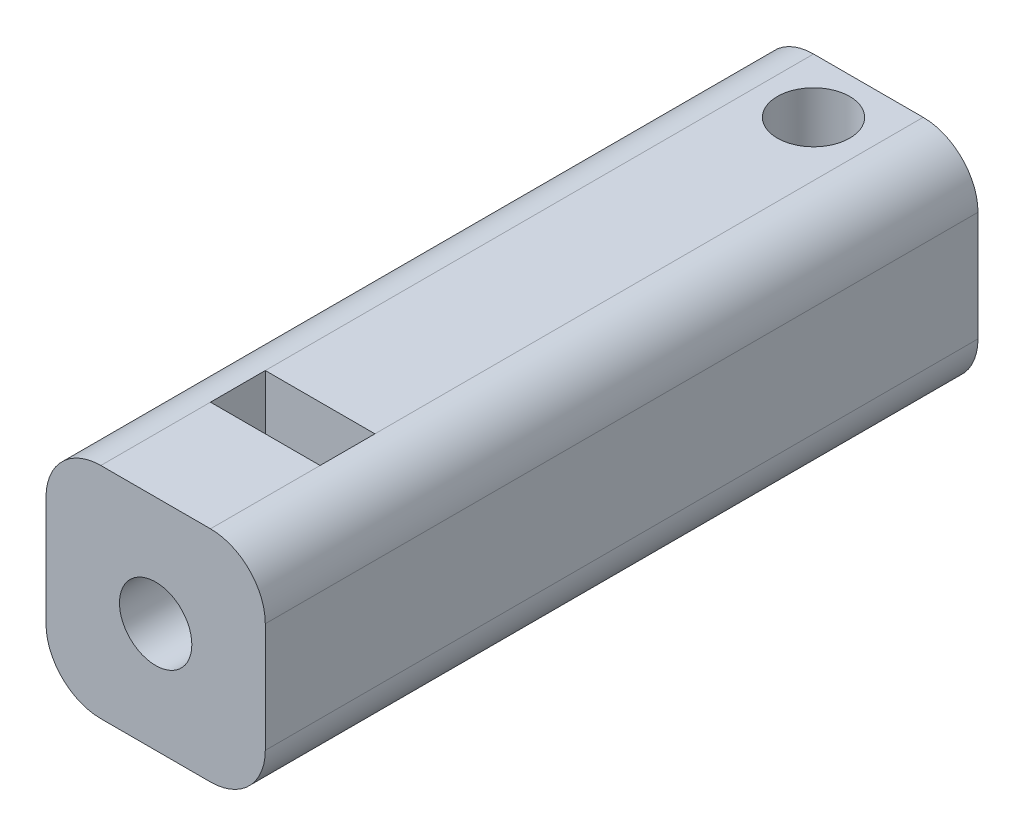
ISO-10303-21;
HEADER;
FILE_DESCRIPTION(('STEP AP214'),'2;1');
FILE_NAME('part.step','',(''),(''),'','','');
FILE_SCHEMA(('AUTOMOTIVE_DESIGN { 1 0 10303 214 1 1 1 1 }'));
ENDSEC;
DATA;
#1=APPLICATION_CONTEXT('core data for automotive mechanical design processes');
#2=APPLICATION_PROTOCOL_DEFINITION('international standard','automotive_design',2000,#1);
#3=PRODUCT_CONTEXT('',#1,'mechanical');
#4=PRODUCT('Part','Part','',(#3));
#5=PRODUCT_RELATED_PRODUCT_CATEGORY('part','',(#4));
#6=PRODUCT_DEFINITION_FORMATION('','',#4);
#7=PRODUCT_DEFINITION_CONTEXT('part definition',#1,'design');
#8=PRODUCT_DEFINITION('design','',#6,#7);
#9=PRODUCT_DEFINITION_SHAPE('','',#8);
#10=(LENGTH_UNIT() NAMED_UNIT(*) SI_UNIT(.MILLI.,.METRE.));
#11=(NAMED_UNIT(*) PLANE_ANGLE_UNIT() SI_UNIT($,.RADIAN.));
#12=(NAMED_UNIT(*) SI_UNIT($,.STERADIAN.) SOLID_ANGLE_UNIT());
#13=UNCERTAINTY_MEASURE_WITH_UNIT(LENGTH_MEASURE(1.E-05),#10,'distance_accuracy_value','');
#14=(GEOMETRIC_REPRESENTATION_CONTEXT(3) GLOBAL_UNCERTAINTY_ASSIGNED_CONTEXT((#13)) GLOBAL_UNIT_ASSIGNED_CONTEXT((#10,
#11,#12)) REPRESENTATION_CONTEXT('',''));
#15=CARTESIAN_POINT('',(0.,0.,0.));
#16=DIRECTION('',(0.,0.,1.));
#17=DIRECTION('',(1.,0.,0.));
#18=AXIS2_PLACEMENT_3D('',#15,#16,#17);
#19=CARTESIAN_POINT('',(0.,0.,0.));
#20=DIRECTION('',(0.,0.,1.));
#21=DIRECTION('',(1.,0.,0.));
#22=AXIS2_PLACEMENT_3D('',#19,#20,#21);
#23=CYLINDRICAL_SURFACE('',#22,3.3);
#24=CARTESIAN_POINT('',(0.,0.,55.));
#25=DIRECTION('',(0.,0.,1.));
#26=DIRECTION('',(1.,0.,0.));
#27=AXIS2_PLACEMENT_3D('',#24,#25,#26);
#28=CIRCLE('',#27,3.3);
#29=CARTESIAN_POINT('',(3.3,0.,55.));
#30=VERTEX_POINT('',#29);
#31=EDGE_CURVE('E319',#30,#30,#28,.F.);
#32=ORIENTED_EDGE('',*,*,#31,.T.);
#33=EDGE_LOOP('',(#32));
#34=FACE_BOUND('',#33,.T.);
#35=CARTESIAN_POINT('',(0.,0.,65.));
#36=DIRECTION('',(0.,0.,1.));
#37=DIRECTION('',(1.,0.,0.));
#38=AXIS2_PLACEMENT_3D('',#35,#36,#37);
#39=CIRCLE('',#38,3.3);
#40=CARTESIAN_POINT('',(3.3,0.,65.));
#41=VERTEX_POINT('',#40);
#42=EDGE_CURVE('E328',#41,#41,#39,.T.);
#43=ORIENTED_EDGE('',*,*,#42,.T.);
#44=EDGE_LOOP('',(#43));
#45=FACE_BOUND('',#44,.T.);
#46=ADVANCED_FACE('F41',(#34,#45),#23,.F.);
#47=CARTESIAN_POINT('',(-10.,10.,65.));
#48=DIRECTION('',(0.,-1.,0.));
#49=DIRECTION('',(0.,0.,-1.));
#50=AXIS2_PLACEMENT_3D('',#47,#48,#49);
#51=PLANE('',#50);
#52=DIRECTION('',(0.,0.,-1.));
#53=VECTOR('',#52,1.);
#54=CARTESIAN_POINT('',(5.,10.,65.));
#55=LINE('',#54,#53);
#56=CARTESIAN_POINT('',(5.,10.,65.));
#57=VERTEX_POINT('',#56);
#58=CARTESIAN_POINT('',(5.,10.,55.));
#59=VERTEX_POINT('',#58);
#60=EDGE_CURVE('E264',#57,#59,#55,.T.);
#61=ORIENTED_EDGE('',*,*,#60,.T.);
#62=DIRECTION('',(-1.,0.,0.));
#63=VECTOR('',#62,1.);
#64=CARTESIAN_POINT('',(-5.,10.,55.));
#65=LINE('',#64,#63);
#66=CARTESIAN_POINT('',(-5.,10.,55.));
#67=VERTEX_POINT('',#66);
#68=EDGE_CURVE('E145',#59,#67,#65,.T.);
#69=ORIENTED_EDGE('',*,*,#68,.T.);
#70=DIRECTION('',(0.,0.,-1.));
#71=VECTOR('',#70,1.);
#72=CARTESIAN_POINT('',(-5.,10.,65.));
#73=LINE('',#72,#71);
#74=CARTESIAN_POINT('',(-5.,10.,65.));
#75=VERTEX_POINT('',#74);
#76=EDGE_CURVE('E164',#67,#75,#73,.F.);
#77=ORIENTED_EDGE('',*,*,#76,.T.);
#78=DIRECTION('',(-1.,0.,0.));
#79=VECTOR('',#78,1.);
#80=CARTESIAN_POINT('',(-10.,10.,65.));
#81=LINE('',#80,#79);
#82=EDGE_CURVE('E218',#57,#75,#81,.T.);
#83=ORIENTED_EDGE('',*,*,#82,.F.);
#84=EDGE_LOOP('',(#61,#69,#77,#83));
#85=FACE_BOUND('',#84,.T.);
#86=ADVANCED_FACE('F345',(#85),#51,.F.);
#87=CARTESIAN_POINT('',(-10.,-10.,65.));
#88=DIRECTION('',(0.,1.,0.));
#89=DIRECTION('',(0.,0.,1.));
#90=AXIS2_PLACEMENT_3D('',#87,#88,#89);
#91=PLANE('',#90);
#92=DIRECTION('',(0.,0.,-1.));
#93=VECTOR('',#92,1.);
#94=CARTESIAN_POINT('',(-5.,-10.,65.));
#95=LINE('',#94,#93);
#96=CARTESIAN_POINT('',(-5.,-10.,65.));
#97=VERTEX_POINT('',#96);
#98=CARTESIAN_POINT('',(-5.,-10.,55.));
#99=VERTEX_POINT('',#98);
#100=EDGE_CURVE('E185',#97,#99,#95,.T.);
#101=ORIENTED_EDGE('',*,*,#100,.T.);
#102=DIRECTION('',(-1.,0.,0.));
#103=VECTOR('',#102,1.);
#104=CARTESIAN_POINT('',(-5.,-10.,55.));
#105=LINE('',#104,#103);
#106=CARTESIAN_POINT('',(5.,-10.,55.));
#107=VERTEX_POINT('',#106);
#108=EDGE_CURVE('E166',#107,#99,#105,.T.);
#109=ORIENTED_EDGE('',*,*,#108,.F.);
#110=DIRECTION('',(0.,0.,1.));
#111=VECTOR('',#110,1.);
#112=CARTESIAN_POINT('',(5.,-10.,65.));
#113=LINE('',#112,#111);
#114=CARTESIAN_POINT('',(5.,-10.,65.));
#115=VERTEX_POINT('',#114);
#116=EDGE_CURVE('E210',#107,#115,#113,.T.);
#117=ORIENTED_EDGE('',*,*,#116,.T.);
#118=DIRECTION('',(1.,0.,0.));
#119=VECTOR('',#118,1.);
#120=CARTESIAN_POINT('',(-10.,-10.,65.));
#121=LINE('',#120,#119);
#122=EDGE_CURVE('E199',#97,#115,#121,.T.);
#123=ORIENTED_EDGE('',*,*,#122,.F.);
#124=EDGE_LOOP('',(#101,#109,#117,#123));
#125=FACE_BOUND('',#124,.T.);
#126=ADVANCED_FACE('F208',(#125),#91,.F.);
#127=CARTESIAN_POINT('',(-5.,-5.,65.));
#128=DIRECTION('',(0.,0.,-1.));
#129=DIRECTION('',(-1.,0.,0.));
#130=AXIS2_PLACEMENT_3D('',#127,#128,#129);
#131=CYLINDRICAL_SURFACE('',#130,5.);
#132=ORIENTED_EDGE('',*,*,#100,.F.);
#133=CARTESIAN_POINT('',(-5.,-5.,65.));
#134=DIRECTION('',(0.,0.,-1.));
#135=DIRECTION('',(-1.,0.,0.));
#136=AXIS2_PLACEMENT_3D('',#133,#134,#135);
#137=CIRCLE('',#136,5.);
#138=CARTESIAN_POINT('',(-10.,-5.,65.));
#139=VERTEX_POINT('',#138);
#140=EDGE_CURVE('E50',#139,#97,#137,.F.);
#141=ORIENTED_EDGE('',*,*,#140,.F.);
#142=DIRECTION('',(0.,0.,-1.));
#143=VECTOR('',#142,1.);
#144=CARTESIAN_POINT('',(-10.,-5.,65.));
#145=LINE('',#144,#143);
#146=CARTESIAN_POINT('',(-10.,-5.,0.));
#147=VERTEX_POINT('',#146);
#148=EDGE_CURVE('E189',#147,#139,#145,.F.);
#149=ORIENTED_EDGE('',*,*,#148,.F.);
#150=CARTESIAN_POINT('',(-5.,-5.,0.));
#151=DIRECTION('',(0.,0.,-1.));
#152=DIRECTION('',(-1.,0.,0.));
#153=AXIS2_PLACEMENT_3D('',#150,#151,#152);
#154=CIRCLE('',#153,5.);
#155=CARTESIAN_POINT('',(-5.,-10.,0.));
#156=VERTEX_POINT('',#155);
#157=EDGE_CURVE('E11',#156,#147,#154,.T.);
#158=ORIENTED_EDGE('',*,*,#157,.F.);
#159=CARTESIAN_POINT('',(-5.,-10.,50.));
#160=VERTEX_POINT('',#159);
#161=EDGE_CURVE('E184',#160,#156,#95,.T.);
#162=ORIENTED_EDGE('',*,*,#161,.F.);
#163=DIRECTION('',(0.,0.,-1.));
#164=VECTOR('',#163,1.);
#165=CARTESIAN_POINT('',(-5.,-10.,50.));
#166=LINE('',#165,#164);
#167=EDGE_CURVE('E65',#99,#160,#166,.T.);
#168=ORIENTED_EDGE('',*,*,#167,.F.);
#169=EDGE_LOOP('',(#132,#141,#149,#158,#162,#168));
#170=FACE_BOUND('',#169,.T.);
#171=ADVANCED_FACE('F43',(#170),#131,.T.);
#172=CARTESIAN_POINT('',(-5.,5.,65.));
#173=DIRECTION('',(0.,0.,-1.));
#174=DIRECTION('',(-1.,0.,0.));
#175=AXIS2_PLACEMENT_3D('',#172,#173,#174);
#176=CYLINDRICAL_SURFACE('',#175,5.);
#177=DIRECTION('',(0.,0.,-1.));
#178=VECTOR('',#177,1.);
#179=CARTESIAN_POINT('',(-10.,5.,65.));
#180=LINE('',#179,#178);
#181=CARTESIAN_POINT('',(-10.,5.,65.));
#182=VERTEX_POINT('',#181);
#183=CARTESIAN_POINT('',(-10.,5.,0.));
#184=VERTEX_POINT('',#183);
#185=EDGE_CURVE('E178',#182,#184,#180,.T.);
#186=ORIENTED_EDGE('',*,*,#185,.F.);
#187=CARTESIAN_POINT('',(-5.,5.,65.));
#188=DIRECTION('',(0.,0.,-1.));
#189=DIRECTION('',(-1.,0.,0.));
#190=AXIS2_PLACEMENT_3D('',#187,#188,#189);
#191=CIRCLE('',#190,5.);
#192=EDGE_CURVE('E172',#75,#182,#191,.F.);
#193=ORIENTED_EDGE('',*,*,#192,.F.);
#194=ORIENTED_EDGE('',*,*,#76,.F.);
#195=DIRECTION('',(0.,0.,-1.));
#196=VECTOR('',#195,1.);
#197=CARTESIAN_POINT('',(-5.,10.,50.));
#198=LINE('',#197,#196);
#199=CARTESIAN_POINT('',(-5.,10.,50.));
#200=VERTEX_POINT('',#199);
#201=EDGE_CURVE('E138',#67,#200,#198,.T.);
#202=ORIENTED_EDGE('',*,*,#201,.T.);
#203=CARTESIAN_POINT('',(-5.,10.,0.));
#204=VERTEX_POINT('',#203);
#205=EDGE_CURVE('E161',#204,#200,#73,.F.);
#206=ORIENTED_EDGE('',*,*,#205,.F.);
#207=CARTESIAN_POINT('',(-5.,5.,0.));
#208=DIRECTION('',(0.,0.,-1.));
#209=DIRECTION('',(-1.,0.,0.));
#210=AXIS2_PLACEMENT_3D('',#207,#208,#209);
#211=CIRCLE('',#210,5.);
#212=EDGE_CURVE('E176',#184,#204,#211,.T.);
#213=ORIENTED_EDGE('',*,*,#212,.F.);
#214=EDGE_LOOP('',(#186,#193,#194,#202,#206,#213));
#215=FACE_BOUND('',#214,.T.);
#216=ADVANCED_FACE('F160',(#215),#176,.T.);
#217=CARTESIAN_POINT('',(5.,5.,65.));
#218=DIRECTION('',(0.,0.,-1.));
#219=DIRECTION('',(-1.,0.,0.));
#220=AXIS2_PLACEMENT_3D('',#217,#218,#219);
#221=CYLINDRICAL_SURFACE('',#220,5.);
#222=ORIENTED_EDGE('',*,*,#60,.F.);
#223=CARTESIAN_POINT('',(5.,5.,65.));
#224=DIRECTION('',(0.,0.,-1.));
#225=DIRECTION('',(-1.,0.,0.));
#226=AXIS2_PLACEMENT_3D('',#223,#224,#225);
#227=CIRCLE('',#226,5.);
#228=CARTESIAN_POINT('',(10.,5.,65.));
#229=VERTEX_POINT('',#228);
#230=EDGE_CURVE('E272',#229,#57,#227,.F.);
#231=ORIENTED_EDGE('',*,*,#230,.F.);
#232=DIRECTION('',(0.,0.,-1.));
#233=VECTOR('',#232,1.);
#234=CARTESIAN_POINT('',(10.,5.,65.));
#235=LINE('',#234,#233);
#236=CARTESIAN_POINT('',(10.,5.,0.));
#237=VERTEX_POINT('',#236);
#238=EDGE_CURVE('E268',#237,#229,#235,.F.);
#239=ORIENTED_EDGE('',*,*,#238,.F.);
#240=CARTESIAN_POINT('',(5.,5.,0.));
#241=DIRECTION('',(0.,0.,-1.));
#242=DIRECTION('',(-1.,0.,0.));
#243=AXIS2_PLACEMENT_3D('',#240,#241,#242);
#244=CIRCLE('',#243,5.);
#245=CARTESIAN_POINT('',(5.,10.,0.));
#246=VERTEX_POINT('',#245);
#247=EDGE_CURVE('E274',#246,#237,#244,.T.);
#248=ORIENTED_EDGE('',*,*,#247,.F.);
#249=CARTESIAN_POINT('',(5.,10.,50.));
#250=VERTEX_POINT('',#249);
#251=EDGE_CURVE('E263',#250,#246,#55,.T.);
#252=ORIENTED_EDGE('',*,*,#251,.F.);
#253=DIRECTION('',(0.,0.,1.));
#254=VECTOR('',#253,1.);
#255=CARTESIAN_POINT('',(5.,10.,55.));
#256=LINE('',#255,#254);
#257=EDGE_CURVE('E57',#250,#59,#256,.T.);
#258=ORIENTED_EDGE('',*,*,#257,.T.);
#259=EDGE_LOOP('',(#222,#231,#239,#248,#252,#258));
#260=FACE_BOUND('',#259,.T.);
#261=ADVANCED_FACE('F352',(#260),#221,.T.);
#262=CARTESIAN_POINT('',(5.,-5.,65.));
#263=DIRECTION('',(0.,0.,1.));
#264=DIRECTION('',(1.,0.,0.));
#265=AXIS2_PLACEMENT_3D('',#262,#263,#264);
#266=CYLINDRICAL_SURFACE('',#265,5.);
#267=CARTESIAN_POINT('',(5.,-10.,0.));
#268=VERTEX_POINT('',#267);
#269=CARTESIAN_POINT('',(5.,-10.,50.));
#270=VERTEX_POINT('',#269);
#271=EDGE_CURVE('E248',#268,#270,#113,.T.);
#272=ORIENTED_EDGE('',*,*,#271,.F.);
#273=CARTESIAN_POINT('',(5.,-5.,0.));
#274=DIRECTION('',(0.,0.,-1.));
#275=DIRECTION('',(-1.,0.,0.));
#276=AXIS2_PLACEMENT_3D('',#273,#274,#275);
#277=CIRCLE('',#276,5.);
#278=CARTESIAN_POINT('',(10.,-5.,0.));
#279=VERTEX_POINT('',#278);
#280=EDGE_CURVE('E256',#279,#268,#277,.T.);
#281=ORIENTED_EDGE('',*,*,#280,.F.);
#282=DIRECTION('',(0.,0.,1.));
#283=VECTOR('',#282,1.);
#284=CARTESIAN_POINT('',(10.,-5.,65.));
#285=LINE('',#284,#283);
#286=CARTESIAN_POINT('',(10.,-5.,65.));
#287=VERTEX_POINT('',#286);
#288=EDGE_CURVE('E252',#287,#279,#285,.F.);
#289=ORIENTED_EDGE('',*,*,#288,.F.);
#290=CARTESIAN_POINT('',(5.,-5.,65.));
#291=DIRECTION('',(0.,0.,-1.));
#292=DIRECTION('',(-1.,0.,0.));
#293=AXIS2_PLACEMENT_3D('',#290,#291,#292);
#294=CIRCLE('',#293,5.);
#295=EDGE_CURVE('E260',#115,#287,#294,.F.);
#296=ORIENTED_EDGE('',*,*,#295,.F.);
#297=ORIENTED_EDGE('',*,*,#116,.F.);
#298=DIRECTION('',(0.,0.,1.));
#299=VECTOR('',#298,1.);
#300=CARTESIAN_POINT('',(5.,-10.,55.));
#301=LINE('',#300,#299);
#302=EDGE_CURVE('E295',#270,#107,#301,.T.);
#303=ORIENTED_EDGE('',*,*,#302,.F.);
#304=EDGE_LOOP('',(#272,#281,#289,#296,#297,#303));
#305=FACE_BOUND('',#304,.T.);
#306=ADVANCED_FACE('F360',(#305),#266,.T.);
#307=CARTESIAN_POINT('',(0.,0.,50.));
#308=DIRECTION('',(0.,0.,-1.));
#309=DIRECTION('',(-1.,0.,0.));
#310=AXIS2_PLACEMENT_3D('',#307,#308,#309);
#311=CIRCLE('',#310,3.3);
#312=CARTESIAN_POINT('',(-3.3,0.,50.));
#313=VERTEX_POINT('',#312);
#314=EDGE_CURVE('E310',#313,#313,#311,.F.);
#315=ORIENTED_EDGE('',*,*,#314,.T.);
#316=EDGE_LOOP('',(#315));
#317=FACE_BOUND('',#316,.T.);
#318=CARTESIAN_POINT('',(0.,0.,5.));
#319=DIRECTION('',(0.,0.707106781186547,0.707106781186547));
#320=DIRECTION('',(0.,-0.707106781186547,0.707106781186547));
#321=AXIS2_PLACEMENT_3D('',#318,#319,#320);
#322=ELLIPSE('',#321,4.66690475583121,3.3);
#323=CARTESIAN_POINT('',(3.3,0.,5.));
#324=VERTEX_POINT('',#323);
#325=CARTESIAN_POINT('',(-3.3,0.,5.));
#326=VERTEX_POINT('',#325);
#327=EDGE_CURVE('E212',#324,#326,#322,.F.);
#328=ORIENTED_EDGE('',*,*,#327,.T.);
#329=CARTESIAN_POINT('',(0.,0.,5.));
#330=DIRECTION('',(0.,-0.707106781186547,0.707106781186547));
#331=DIRECTION('',(0.,0.707106781186547,0.707106781186547));
#332=AXIS2_PLACEMENT_3D('',#329,#330,#331);
#333=ELLIPSE('',#332,4.66690475583121,3.3);
#334=EDGE_CURVE('E244',#326,#324,#333,.F.);
#335=ORIENTED_EDGE('',*,*,#334,.T.);
#336=EDGE_LOOP('',(#328,#335));
#337=FACE_BOUND('',#336,.T.);
#338=ADVANCED_FACE('F372',(#317,#337),#23,.F.);
#339=CARTESIAN_POINT('',(10.,-10.,65.));
#340=DIRECTION('',(-1.,0.,0.));
#341=DIRECTION('',(0.,0.,1.));
#342=AXIS2_PLACEMENT_3D('',#339,#340,#341);
#343=PLANE('',#342);
#344=DIRECTION('',(0.,1.,0.));
#345=VECTOR('',#344,1.);
#346=CARTESIAN_POINT('',(10.,-10.,0.));
#347=LINE('',#346,#345);
#348=EDGE_CURVE('E222',#279,#237,#347,.T.);
#349=ORIENTED_EDGE('',*,*,#348,.T.);
#350=ORIENTED_EDGE('',*,*,#238,.T.);
#351=DIRECTION('',(0.,1.,0.));
#352=VECTOR('',#351,1.);
#353=CARTESIAN_POINT('',(10.,-10.,65.));
#354=LINE('',#353,#352);
#355=EDGE_CURVE('E235',#287,#229,#354,.T.);
#356=ORIENTED_EDGE('',*,*,#355,.F.);
#357=ORIENTED_EDGE('',*,*,#288,.T.);
#358=EDGE_LOOP('',(#349,#350,#356,#357));
#359=FACE_BOUND('',#358,.T.);
#360=ADVANCED_FACE('F357',(#359),#343,.F.);
#361=CARTESIAN_POINT('',(0.,10.,5.));
#362=DIRECTION('',(0.,-1.,0.));
#363=DIRECTION('',(0.,0.,-1.));
#364=AXIS2_PLACEMENT_3D('',#361,#362,#363);
#365=CIRCLE('',#364,3.3);
#366=CARTESIAN_POINT('',(0.,10.,1.7));
#367=VERTEX_POINT('',#366);
#368=EDGE_CURVE('E324',#367,#367,#365,.T.);
#369=ORIENTED_EDGE('',*,*,#368,.T.);
#370=EDGE_LOOP('',(#369));
#371=FACE_BOUND('',#370,.T.);
#372=ORIENTED_EDGE('',*,*,#205,.T.);
#373=DIRECTION('',(1.,0.,0.));
#374=VECTOR('',#373,1.);
#375=CARTESIAN_POINT('',(5.,10.,50.));
#376=LINE('',#375,#374);
#377=EDGE_CURVE('E148',#200,#250,#376,.T.);
#378=ORIENTED_EDGE('',*,*,#377,.T.);
#379=ORIENTED_EDGE('',*,*,#251,.T.);
#380=DIRECTION('',(-1.,0.,0.));
#381=VECTOR('',#380,1.);
#382=CARTESIAN_POINT('',(-10.,10.,0.));
#383=LINE('',#382,#381);
#384=EDGE_CURVE('E170',#246,#204,#383,.T.);
#385=ORIENTED_EDGE('',*,*,#384,.T.);
#386=EDGE_LOOP('',(#372,#378,#379,#385));
#387=FACE_BOUND('',#386,.T.);
#388=ADVANCED_FACE('F168',(#371,#387),#51,.F.);
#389=CARTESIAN_POINT('',(-10.,-10.,65.));
#390=DIRECTION('',(1.,0.,0.));
#391=DIRECTION('',(0.,0.,-1.));
#392=AXIS2_PLACEMENT_3D('',#389,#390,#391);
#393=PLANE('',#392);
#394=DIRECTION('',(0.,-1.,0.));
#395=VECTOR('',#394,1.);
#396=CARTESIAN_POINT('',(-10.,-10.,0.));
#397=LINE('',#396,#395);
#398=EDGE_CURVE('E229',#184,#147,#397,.T.);
#399=ORIENTED_EDGE('',*,*,#398,.T.);
#400=ORIENTED_EDGE('',*,*,#148,.T.);
#401=DIRECTION('',(0.,-1.,0.));
#402=VECTOR('',#401,1.);
#403=CARTESIAN_POINT('',(-10.,-10.,65.));
#404=LINE('',#403,#402);
#405=EDGE_CURVE('E202',#182,#139,#404,.T.);
#406=ORIENTED_EDGE('',*,*,#405,.F.);
#407=ORIENTED_EDGE('',*,*,#185,.T.);
#408=EDGE_LOOP('',(#399,#400,#406,#407));
#409=FACE_BOUND('',#408,.T.);
#410=ADVANCED_FACE('F284',(#409),#393,.F.);
#411=CARTESIAN_POINT('',(0.,-10.,5.));
#412=DIRECTION('',(0.,-1.,0.));
#413=DIRECTION('',(0.,0.,-1.));
#414=AXIS2_PLACEMENT_3D('',#411,#412,#413);
#415=CIRCLE('',#414,3.3);
#416=CARTESIAN_POINT('',(0.,-10.,1.7));
#417=VERTEX_POINT('',#416);
#418=EDGE_CURVE('E323',#417,#417,#415,.T.);
#419=ORIENTED_EDGE('',*,*,#418,.F.);
#420=EDGE_LOOP('',(#419));
#421=FACE_BOUND('',#420,.T.);
#422=ORIENTED_EDGE('',*,*,#271,.T.);
#423=DIRECTION('',(1.,0.,0.));
#424=VECTOR('',#423,1.);
#425=CARTESIAN_POINT('',(5.,-10.,50.));
#426=LINE('',#425,#424);
#427=EDGE_CURVE('E291',#160,#270,#426,.T.);
#428=ORIENTED_EDGE('',*,*,#427,.F.);
#429=ORIENTED_EDGE('',*,*,#161,.T.);
#430=DIRECTION('',(1.,0.,0.));
#431=VECTOR('',#430,1.);
#432=CARTESIAN_POINT('',(-10.,-10.,0.));
#433=LINE('',#432,#431);
#434=EDGE_CURVE('E233',#156,#268,#433,.T.);
#435=ORIENTED_EDGE('',*,*,#434,.T.);
#436=EDGE_LOOP('',(#422,#428,#429,#435));
#437=FACE_BOUND('',#436,.T.);
#438=ADVANCED_FACE('F290',(#421,#437),#91,.F.);
#439=CARTESIAN_POINT('',(0.,0.,65.));
#440=DIRECTION('',(0.,0.,-1.));
#441=DIRECTION('',(-1.,0.,0.));
#442=AXIS2_PLACEMENT_3D('',#439,#440,#441);
#443=PLANE('',#442);
#444=ORIENTED_EDGE('',*,*,#42,.F.);
#445=EDGE_LOOP('',(#444));
#446=FACE_BOUND('',#445,.T.);
#447=ORIENTED_EDGE('',*,*,#405,.T.);
#448=ORIENTED_EDGE('',*,*,#140,.T.);
#449=ORIENTED_EDGE('',*,*,#122,.T.);
#450=ORIENTED_EDGE('',*,*,#295,.T.);
#451=ORIENTED_EDGE('',*,*,#355,.T.);
#452=ORIENTED_EDGE('',*,*,#230,.T.);
#453=ORIENTED_EDGE('',*,*,#82,.T.);
#454=ORIENTED_EDGE('',*,*,#192,.T.);
#455=EDGE_LOOP('',(#447,#448,#449,#450,#451,#452,#453,#454));
#456=FACE_BOUND('',#455,.T.);
#457=ADVANCED_FACE('F197',(#446,#456),#443,.F.);
#458=CARTESIAN_POINT('',(0.,0.,0.));
#459=DIRECTION('',(0.,0.,-1.));
#460=DIRECTION('',(-1.,0.,0.));
#461=AXIS2_PLACEMENT_3D('',#458,#459,#460);
#462=PLANE('',#461);
#463=CARTESIAN_POINT('',(0.,0.,0.));
#464=DIRECTION('',(0.,0.,1.));
#465=DIRECTION('',(1.,0.,0.));
#466=AXIS2_PLACEMENT_3D('',#463,#464,#465);
#467=CIRCLE('',#466,3.3);
#468=CARTESIAN_POINT('',(3.3,0.,0.));
#469=VERTEX_POINT('',#468);
#470=EDGE_CURVE('E226',#469,#469,#467,.T.);
#471=ORIENTED_EDGE('',*,*,#470,.T.);
#472=EDGE_LOOP('',(#471));
#473=FACE_BOUND('',#472,.T.);
#474=ORIENTED_EDGE('',*,*,#434,.F.);
#475=ORIENTED_EDGE('',*,*,#157,.T.);
#476=ORIENTED_EDGE('',*,*,#398,.F.);
#477=ORIENTED_EDGE('',*,*,#212,.T.);
#478=ORIENTED_EDGE('',*,*,#384,.F.);
#479=ORIENTED_EDGE('',*,*,#247,.T.);
#480=ORIENTED_EDGE('',*,*,#348,.F.);
#481=ORIENTED_EDGE('',*,*,#280,.T.);
#482=EDGE_LOOP('',(#474,#475,#476,#477,#478,#479,#480,#481));
#483=FACE_BOUND('',#482,.T.);
#484=ADVANCED_FACE('F286',(#473,#483),#462,.T.);
#485=CARTESIAN_POINT('',(0.,0.,5.));
#486=DIRECTION('',(0.,0.707106781186547,0.707106781186547));
#487=DIRECTION('',(0.,-0.707106781186547,0.707106781186547));
#488=AXIS2_PLACEMENT_3D('',#485,#486,#487);
#489=ELLIPSE('',#488,4.66690475583121,3.3);
#490=EDGE_CURVE('E216',#324,#326,#489,.T.);
#491=ORIENTED_EDGE('',*,*,#490,.T.);
#492=CARTESIAN_POINT('',(0.,0.,5.));
#493=DIRECTION('',(0.,-0.707106781186547,0.707106781186547));
#494=DIRECTION('',(0.,0.707106781186547,0.707106781186547));
#495=AXIS2_PLACEMENT_3D('',#492,#493,#494);
#496=ELLIPSE('',#495,4.66690475583121,3.3);
#497=EDGE_CURVE('E240',#326,#324,#496,.T.);
#498=ORIENTED_EDGE('',*,*,#497,.T.);
#499=EDGE_LOOP('',(#491,#498));
#500=FACE_BOUND('',#499,.T.);
#501=ORIENTED_EDGE('',*,*,#470,.F.);
#502=EDGE_LOOP('',(#501));
#503=FACE_BOUND('',#502,.T.);
#504=ADVANCED_FACE('F373',(#500,#503),#23,.F.);
#505=CARTESIAN_POINT('',(0.,10.,5.));
#506=DIRECTION('',(0.,-1.,0.));
#507=DIRECTION('',(0.,0.,-1.));
#508=AXIS2_PLACEMENT_3D('',#505,#506,#507);
#509=CYLINDRICAL_SURFACE('',#508,3.3);
#510=ORIENTED_EDGE('',*,*,#418,.T.);
#511=EDGE_LOOP('',(#510));
#512=FACE_BOUND('',#511,.T.);
#513=ORIENTED_EDGE('',*,*,#327,.F.);
#514=ORIENTED_EDGE('',*,*,#497,.F.);
#515=EDGE_LOOP('',(#513,#514));
#516=FACE_BOUND('',#515,.T.);
#517=ADVANCED_FACE('F451',(#512,#516),#509,.F.);
#518=ORIENTED_EDGE('',*,*,#368,.F.);
#519=EDGE_LOOP('',(#518));
#520=FACE_BOUND('',#519,.T.);
#521=ORIENTED_EDGE('',*,*,#490,.F.);
#522=ORIENTED_EDGE('',*,*,#334,.F.);
#523=EDGE_LOOP('',(#521,#522));
#524=FACE_BOUND('',#523,.T.);
#525=ADVANCED_FACE('F365',(#520,#524),#509,.F.);
#526=CARTESIAN_POINT('',(-5.,10.,55.));
#527=DIRECTION('',(0.,0.,1.));
#528=DIRECTION('',(1.,0.,0.));
#529=AXIS2_PLACEMENT_3D('',#526,#527,#528);
#530=PLANE('',#529);
#531=ORIENTED_EDGE('',*,*,#108,.T.);
#532=DIRECTION('',(0.,-1.,0.));
#533=VECTOR('',#532,1.);
#534=CARTESIAN_POINT('',(-5.,10.,55.));
#535=LINE('',#534,#533);
#536=EDGE_CURVE('E307',#67,#99,#535,.T.);
#537=ORIENTED_EDGE('',*,*,#536,.F.);
#538=ORIENTED_EDGE('',*,*,#68,.F.);
#539=DIRECTION('',(0.,-1.,0.));
#540=VECTOR('',#539,1.);
#541=CARTESIAN_POINT('',(5.,10.,55.));
#542=LINE('',#541,#540);
#543=EDGE_CURVE('E311',#59,#107,#542,.T.);
#544=ORIENTED_EDGE('',*,*,#543,.T.);
#545=EDGE_LOOP('',(#531,#537,#538,#544));
#546=FACE_BOUND('',#545,.T.);
#547=ORIENTED_EDGE('',*,*,#31,.F.);
#548=EDGE_LOOP('',(#547));
#549=FACE_BOUND('',#548,.T.);
#550=ADVANCED_FACE('F362',(#546,#549),#530,.F.);
#551=CARTESIAN_POINT('',(5.,10.,50.));
#552=DIRECTION('',(0.,0.,-1.));
#553=DIRECTION('',(-1.,0.,0.));
#554=AXIS2_PLACEMENT_3D('',#551,#552,#553);
#555=PLANE('',#554);
#556=ORIENTED_EDGE('',*,*,#427,.T.);
#557=DIRECTION('',(0.,-1.,0.));
#558=VECTOR('',#557,1.);
#559=CARTESIAN_POINT('',(5.,10.,50.));
#560=LINE('',#559,#558);
#561=EDGE_CURVE('E144',#250,#270,#560,.T.);
#562=ORIENTED_EDGE('',*,*,#561,.F.);
#563=ORIENTED_EDGE('',*,*,#377,.F.);
#564=DIRECTION('',(0.,-1.,0.));
#565=VECTOR('',#564,1.);
#566=CARTESIAN_POINT('',(-5.,10.,50.));
#567=LINE('',#566,#565);
#568=EDGE_CURVE('E134',#200,#160,#567,.T.);
#569=ORIENTED_EDGE('',*,*,#568,.T.);
#570=EDGE_LOOP('',(#556,#562,#563,#569));
#571=FACE_BOUND('',#570,.T.);
#572=ORIENTED_EDGE('',*,*,#314,.F.);
#573=EDGE_LOOP('',(#572));
#574=FACE_BOUND('',#573,.T.);
#575=ADVANCED_FACE('F149',(#571,#574),#555,.F.);
#576=CARTESIAN_POINT('',(-5.,10.,50.));
#577=DIRECTION('',(-1.,0.,0.));
#578=DIRECTION('',(0.,0.,1.));
#579=AXIS2_PLACEMENT_3D('',#576,#577,#578);
#580=PLANE('',#579);
#581=ORIENTED_EDGE('',*,*,#167,.T.);
#582=ORIENTED_EDGE('',*,*,#568,.F.);
#583=ORIENTED_EDGE('',*,*,#201,.F.);
#584=ORIENTED_EDGE('',*,*,#536,.T.);
#585=EDGE_LOOP('',(#581,#582,#583,#584));
#586=FACE_BOUND('',#585,.T.);
#587=ADVANCED_FACE('F136',(#586),#580,.F.);
#588=CARTESIAN_POINT('',(5.,10.,55.));
#589=DIRECTION('',(1.,0.,0.));
#590=DIRECTION('',(0.,0.,-1.));
#591=AXIS2_PLACEMENT_3D('',#588,#589,#590);
#592=PLANE('',#591);
#593=ORIENTED_EDGE('',*,*,#302,.T.);
#594=ORIENTED_EDGE('',*,*,#543,.F.);
#595=ORIENTED_EDGE('',*,*,#257,.F.);
#596=ORIENTED_EDGE('',*,*,#561,.T.);
#597=EDGE_LOOP('',(#593,#594,#595,#596));
#598=FACE_BOUND('',#597,.T.);
#599=ADVANCED_FACE('F361',(#598),#592,.F.);
#600=CLOSED_SHELL('',(#46,#86,#126,#171,#216,#261,#306,#338,#360,#388,#410,#438,#457,#484,#504,
#517,#525,#550,#575,#587,#599));
#601=MANIFOLD_SOLID_BREP('B2',#600);
#602=ADVANCED_BREP_SHAPE_REPRESENTATION('',(#18,#601),#14);
#603=SHAPE_DEFINITION_REPRESENTATION(#9,#602);
ENDSEC;
END-ISO-10303-21;
